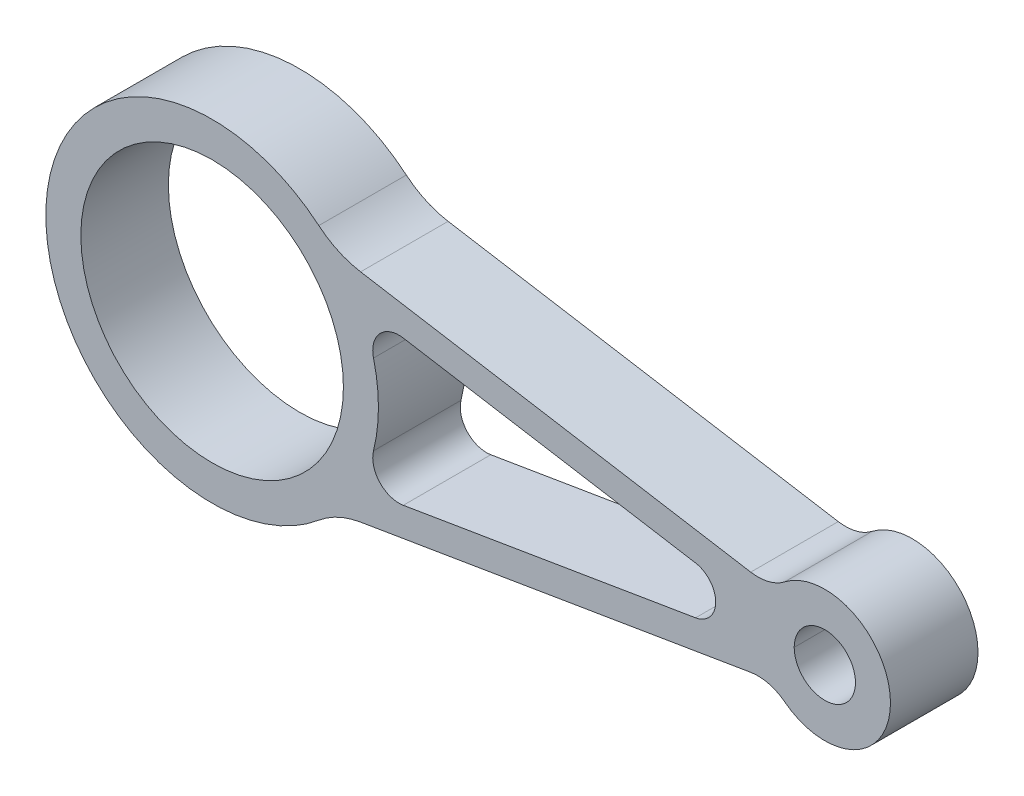
ISO-10303-21;
HEADER;
FILE_DESCRIPTION(('STEP AP214'),'2;1');
FILE_NAME('part.step','',(''),(''),'','','');
FILE_SCHEMA(('AUTOMOTIVE_DESIGN { 1 0 10303 214 1 1 1 1 }'));
ENDSEC;
DATA;
#1=APPLICATION_CONTEXT('core data for automotive mechanical design processes');
#2=APPLICATION_PROTOCOL_DEFINITION('international standard','automotive_design',2000,#1);
#3=PRODUCT_CONTEXT('',#1,'mechanical');
#4=PRODUCT('Part','Part','',(#3));
#5=PRODUCT_RELATED_PRODUCT_CATEGORY('part','',(#4));
#6=PRODUCT_DEFINITION_FORMATION('','',#4);
#7=PRODUCT_DEFINITION_CONTEXT('part definition',#1,'design');
#8=PRODUCT_DEFINITION('design','',#6,#7);
#9=PRODUCT_DEFINITION_SHAPE('','',#8);
#10=(LENGTH_UNIT() NAMED_UNIT(*) SI_UNIT(.MILLI.,.METRE.));
#11=(NAMED_UNIT(*) PLANE_ANGLE_UNIT() SI_UNIT($,.RADIAN.));
#12=(NAMED_UNIT(*) SI_UNIT($,.STERADIAN.) SOLID_ANGLE_UNIT());
#13=UNCERTAINTY_MEASURE_WITH_UNIT(LENGTH_MEASURE(1.E-05),#10,'distance_accuracy_value','');
#14=(GEOMETRIC_REPRESENTATION_CONTEXT(3) GLOBAL_UNCERTAINTY_ASSIGNED_CONTEXT((#13)) GLOBAL_UNIT_ASSIGNED_CONTEXT((#10,
#11,#12)) REPRESENTATION_CONTEXT('',''));
#15=CARTESIAN_POINT('',(0.,0.,0.));
#16=DIRECTION('',(0.,0.,1.));
#17=DIRECTION('',(1.,0.,0.));
#18=AXIS2_PLACEMENT_3D('',#15,#16,#17);
#19=CARTESIAN_POINT('',(140.,0.,10.));
#20=DIRECTION('',(0.,0.,-1.));
#21=DIRECTION('',(-1.,0.,0.));
#22=AXIS2_PLACEMENT_3D('',#19,#20,#21);
#23=CYLINDRICAL_SURFACE('',#22,7.00000000000001);
#24=CARTESIAN_POINT('',(140.,0.,10.));
#25=DIRECTION('',(0.,0.,1.));
#26=DIRECTION('',(1.,0.,0.));
#27=AXIS2_PLACEMENT_3D('',#24,#25,#26);
#28=CIRCLE('',#27,7.00000000000001);
#29=CARTESIAN_POINT('',(133.,0.,10.));
#30=VERTEX_POINT('',#29);
#31=CARTESIAN_POINT('',(147.,0.,10.));
#32=VERTEX_POINT('',#31);
#33=EDGE_CURVE('E211',#30,#32,#28,.T.);
#34=ORIENTED_EDGE('',*,*,#33,.T.);
#35=DIRECTION('',(0.,0.,-1.));
#36=VECTOR('',#35,1.);
#37=CARTESIAN_POINT('',(147.,0.,10.));
#38=LINE('',#37,#36);
#39=CARTESIAN_POINT('',(147.,0.,-10.));
#40=VERTEX_POINT('',#39);
#41=EDGE_CURVE('E11',#32,#40,#38,.T.);
#42=ORIENTED_EDGE('',*,*,#41,.T.);
#43=CARTESIAN_POINT('',(140.,0.,-10.));
#44=DIRECTION('',(0.,0.,1.));
#45=DIRECTION('',(1.,0.,0.));
#46=AXIS2_PLACEMENT_3D('',#43,#44,#45);
#47=CIRCLE('',#46,7.00000000000001);
#48=CARTESIAN_POINT('',(133.,0.,-10.));
#49=VERTEX_POINT('',#48);
#50=EDGE_CURVE('E215',#49,#40,#47,.T.);
#51=ORIENTED_EDGE('',*,*,#50,.F.);
#52=DIRECTION('',(0.,0.,1.));
#53=VECTOR('',#52,1.);
#54=CARTESIAN_POINT('',(133.,0.,10.));
#55=LINE('',#54,#53);
#56=EDGE_CURVE('E49',#49,#30,#55,.T.);
#57=ORIENTED_EDGE('',*,*,#56,.T.);
#58=EDGE_LOOP('',(#34,#42,#51,#57));
#59=FACE_BOUND('',#58,.T.);
#60=ADVANCED_FACE('F40',(#59),#23,.F.);
#61=CARTESIAN_POINT('',(0.,0.,10.));
#62=DIRECTION('',(0.,0.,1.));
#63=DIRECTION('',(1.,0.,0.));
#64=AXIS2_PLACEMENT_3D('',#61,#62,#63);
#65=PLANE('',#64);
#66=CARTESIAN_POINT('',(109.565217391304,0.,10.));
#67=DIRECTION('',(0.,0.,1.));
#68=DIRECTION('',(-1.,0.,0.));
#69=AXIS2_PLACEMENT_3D('',#66,#67,#68);
#70=CIRCLE('',#69,5.5);
#71=CARTESIAN_POINT('',(110.468788819876,-5.42527037791384,10.));
#72=VERTEX_POINT('',#71);
#73=CARTESIAN_POINT('',(110.468788819876,5.42527037791384,10.));
#74=VERTEX_POINT('',#73);
#75=EDGE_CURVE('E158',#72,#74,#70,.T.);
#76=ORIENTED_EDGE('',*,*,#75,.F.);
#77=DIRECTION('',(0.986412795984335,0.164285714285714,0.));
#78=VECTOR('',#77,1.);
#79=CARTESIAN_POINT('',(110.468788819876,-5.42527037791384,10.));
#80=LINE('',#79,#78);
#81=CARTESIAN_POINT('',(43.6823589039623,-16.5484597647463,10.));
#82=VERTEX_POINT('',#81);
#83=EDGE_CURVE('E177',#82,#72,#80,.T.);
#84=ORIENTED_EDGE('',*,*,#83,.F.);
#85=CARTESIAN_POINT('',(42.696644618248,-10.6299829888402,10.));
#86=DIRECTION('',(0.,0.,1.));
#87=DIRECTION('',(-1.,0.,0.));
#88=AXIS2_PLACEMENT_3D('',#85,#86,#87);
#89=CIRCLE('',#88,6.);
#90=CARTESIAN_POINT('',(36.8743748975778,-9.18043985399842,10.));
#91=VERTEX_POINT('',#90);
#92=EDGE_CURVE('E180',#91,#82,#89,.T.);
#93=ORIENTED_EDGE('',*,*,#92,.F.);
#94=CARTESIAN_POINT('',(0.,0.,10.));
#95=DIRECTION('',(0.,0.,-1.));
#96=DIRECTION('',(1.,0.,0.));
#97=AXIS2_PLACEMENT_3D('',#94,#95,#96);
#98=CIRCLE('',#97,38.);
#99=CARTESIAN_POINT('',(36.8743748975778,9.18043985399841,10.));
#100=VERTEX_POINT('',#99);
#101=EDGE_CURVE('E196',#100,#91,#98,.T.);
#102=ORIENTED_EDGE('',*,*,#101,.F.);
#103=CARTESIAN_POINT('',(42.696644618248,10.6299829888403,10.));
#104=DIRECTION('',(0.,0.,1.));
#105=DIRECTION('',(1.,0.,0.));
#106=AXIS2_PLACEMENT_3D('',#103,#104,#105);
#107=CIRCLE('',#106,6.);
#108=CARTESIAN_POINT('',(43.6823589039623,16.5484597647463,10.));
#109=VERTEX_POINT('',#108);
#110=EDGE_CURVE('E193',#109,#100,#107,.T.);
#111=ORIENTED_EDGE('',*,*,#110,.F.);
#112=DIRECTION('',(-0.986412795984335,0.164285714285714,0.));
#113=VECTOR('',#112,1.);
#114=CARTESIAN_POINT('',(43.6823589039623,16.5484597647463,10.));
#115=LINE('',#114,#113);
#116=EDGE_CURVE('E191',#74,#109,#115,.T.);
#117=ORIENTED_EDGE('',*,*,#116,.F.);
#118=EDGE_LOOP('',(#76,#84,#93,#102,#111,#117));
#119=FACE_BOUND('',#118,.T.);
#120=CARTESIAN_POINT('',(0.,0.,10.));
#121=DIRECTION('',(0.,0.,1.));
#122=DIRECTION('',(1.,0.,0.));
#123=AXIS2_PLACEMENT_3D('',#120,#121,#122);
#124=CIRCLE('',#123,30.);
#125=CARTESIAN_POINT('',(30.,0.,10.));
#126=VERTEX_POINT('',#125);
#127=EDGE_CURVE('E218',#126,#126,#124,.T.);
#128=ORIENTED_EDGE('',*,*,#127,.F.);
#129=EDGE_LOOP('',(#128));
#130=FACE_BOUND('',#129,.T.);
#131=CARTESIAN_POINT('',(140.,0.,10.));
#132=DIRECTION('',(0.,0.,1.));
#133=DIRECTION('',(1.,0.,0.));
#134=AXIS2_PLACEMENT_3D('',#131,#132,#133);
#135=CIRCLE('',#134,15.);
#136=CARTESIAN_POINT('',(130.826967155943,-11.8682546501942,10.));
#137=VERTEX_POINT('',#136);
#138=CARTESIAN_POINT('',(130.826967155943,11.8682546501942,10.));
#139=VERTEX_POINT('',#138);
#140=EDGE_CURVE('E231',#137,#139,#135,.T.);
#141=ORIENTED_EDGE('',*,*,#140,.T.);
#142=CARTESIAN_POINT('',(124.711611926572,19.7804244169904,10.));
#143=DIRECTION('',(0.,0.,1.));
#144=DIRECTION('',(1.,0.,0.));
#145=AXIS2_PLACEMENT_3D('',#142,#143,#144);
#146=CIRCLE('',#145,10.);
#147=CARTESIAN_POINT('',(123.068754783715,9.91629645714704,10.));
#148=VERTEX_POINT('',#147);
#149=EDGE_CURVE('E281',#139,#148,#146,.F.);
#150=ORIENTED_EDGE('',*,*,#149,.T.);
#151=DIRECTION('',(-0.986412795984335,0.164285714285714,0.));
#152=VECTOR('',#151,1.);
#153=CARTESIAN_POINT('',(27.9354736759495,25.7606154914888,10.));
#154=LINE('',#153,#152);
#155=CARTESIAN_POINT('',(33.9230677395359,24.7633898151861,10.));
#156=VERTEX_POINT('',#155);
#157=EDGE_CURVE('E234',#148,#156,#154,.T.);
#158=ORIENTED_EDGE('',*,*,#157,.T.);
#159=CARTESIAN_POINT('',(37.2087820252501,44.4916457348728,10.));
#160=DIRECTION('',(0.,0.,1.));
#161=DIRECTION('',(1.,0.,0.));
#162=AXIS2_PLACEMENT_3D('',#159,#160,#161);
#163=CIRCLE('',#162,20.);
#164=CARTESIAN_POINT('',(24.3781675337846,29.1496989297442,10.));
#165=VERTEX_POINT('',#164);
#166=EDGE_CURVE('E263',#156,#165,#163,.F.);
#167=ORIENTED_EDGE('',*,*,#166,.T.);
#168=CARTESIAN_POINT('',(0.,0.,10.));
#169=DIRECTION('',(0.,0.,1.));
#170=DIRECTION('',(1.,0.,0.));
#171=AXIS2_PLACEMENT_3D('',#168,#169,#170);
#172=CIRCLE('',#171,38.);
#173=CARTESIAN_POINT('',(24.3781675337846,-29.1496989297442,10.));
#174=VERTEX_POINT('',#173);
#175=EDGE_CURVE('E224',#165,#174,#172,.T.);
#176=ORIENTED_EDGE('',*,*,#175,.T.);
#177=CARTESIAN_POINT('',(37.2087820252502,-44.4916457348727,10.));
#178=DIRECTION('',(0.,0.,1.));
#179=DIRECTION('',(1.,0.,0.));
#180=AXIS2_PLACEMENT_3D('',#177,#178,#179);
#181=CIRCLE('',#180,20.);
#182=CARTESIAN_POINT('',(33.9230677395359,-24.763389815186,10.));
#183=VERTEX_POINT('',#182);
#184=EDGE_CURVE('E258',#174,#183,#181,.F.);
#185=ORIENTED_EDGE('',*,*,#184,.T.);
#186=DIRECTION('',(0.986412795984335,0.164285714285714,0.));
#187=VECTOR('',#186,1.);
#188=CARTESIAN_POINT('',(27.9354736759495,-25.7606154914888,10.));
#189=LINE('',#188,#187);
#190=CARTESIAN_POINT('',(123.068754783715,-9.91629645714704,10.));
#191=VERTEX_POINT('',#190);
#192=EDGE_CURVE('E227',#183,#191,#189,.T.);
#193=ORIENTED_EDGE('',*,*,#192,.T.);
#194=CARTESIAN_POINT('',(124.711611926572,-19.7804244169904,10.));
#195=DIRECTION('',(0.,0.,1.));
#196=DIRECTION('',(1.,0.,0.));
#197=AXIS2_PLACEMENT_3D('',#194,#195,#196);
#198=CIRCLE('',#197,10.);
#199=EDGE_CURVE('E277',#191,#137,#198,.F.);
#200=ORIENTED_EDGE('',*,*,#199,.T.);
#201=EDGE_LOOP('',(#141,#150,#158,#167,#176,#185,#193,#200));
#202=FACE_BOUND('',#201,.T.);
#203=ORIENTED_EDGE('',*,*,#33,.F.);
#204=EDGE_CURVE('E214',#32,#30,#28,.T.);
#205=ORIENTED_EDGE('',*,*,#204,.F.);
#206=EDGE_LOOP('',(#203,#205));
#207=FACE_BOUND('',#206,.T.);
#208=ADVANCED_FACE('F289',(#119,#130,#202,#207),#65,.T.);
#209=CARTESIAN_POINT('',(0.,0.,-10.));
#210=DIRECTION('',(0.,0.,1.));
#211=DIRECTION('',(1.,0.,0.));
#212=AXIS2_PLACEMENT_3D('',#209,#210,#211);
#213=PLANE('',#212);
#214=DIRECTION('',(0.986412795984335,0.164285714285714,0.));
#215=VECTOR('',#214,1.);
#216=CARTESIAN_POINT('',(110.468788819876,-5.42527037791384,-10.));
#217=LINE('',#216,#215);
#218=CARTESIAN_POINT('',(43.6823589039623,-16.5484597647463,-10.));
#219=VERTEX_POINT('',#218);
#220=CARTESIAN_POINT('',(110.468788819876,-5.42527037791384,-10.));
#221=VERTEX_POINT('',#220);
#222=EDGE_CURVE('E163',#219,#221,#217,.T.);
#223=ORIENTED_EDGE('',*,*,#222,.T.);
#224=CARTESIAN_POINT('',(109.565217391304,0.,-10.));
#225=DIRECTION('',(0.,0.,1.));
#226=DIRECTION('',(-1.,0.,0.));
#227=AXIS2_PLACEMENT_3D('',#224,#225,#226);
#228=CIRCLE('',#227,5.5);
#229=CARTESIAN_POINT('',(110.468788819876,5.42527037791384,-10.));
#230=VERTEX_POINT('',#229);
#231=EDGE_CURVE('E155',#221,#230,#228,.T.);
#232=ORIENTED_EDGE('',*,*,#231,.T.);
#233=DIRECTION('',(-0.986412795984335,0.164285714285714,0.));
#234=VECTOR('',#233,1.);
#235=CARTESIAN_POINT('',(43.6823589039623,16.5484597647463,-10.));
#236=LINE('',#235,#234);
#237=CARTESIAN_POINT('',(43.6823589039623,16.5484597647463,-10.));
#238=VERTEX_POINT('',#237);
#239=EDGE_CURVE('E167',#230,#238,#236,.T.);
#240=ORIENTED_EDGE('',*,*,#239,.T.);
#241=CARTESIAN_POINT('',(42.696644618248,10.6299829888403,-10.));
#242=DIRECTION('',(0.,0.,1.));
#243=DIRECTION('',(1.,0.,0.));
#244=AXIS2_PLACEMENT_3D('',#241,#242,#243);
#245=CIRCLE('',#244,6.);
#246=CARTESIAN_POINT('',(36.8743748975778,9.18043985399841,-10.));
#247=VERTEX_POINT('',#246);
#248=EDGE_CURVE('E171',#238,#247,#245,.T.);
#249=ORIENTED_EDGE('',*,*,#248,.T.);
#250=CARTESIAN_POINT('',(0.,0.,-10.));
#251=DIRECTION('',(0.,0.,-1.));
#252=DIRECTION('',(1.,0.,0.));
#253=AXIS2_PLACEMENT_3D('',#250,#251,#252);
#254=CIRCLE('',#253,38.);
#255=CARTESIAN_POINT('',(36.8743748975778,-9.18043985399842,-10.));
#256=VERTEX_POINT('',#255);
#257=EDGE_CURVE('E184',#247,#256,#254,.T.);
#258=ORIENTED_EDGE('',*,*,#257,.T.);
#259=CARTESIAN_POINT('',(42.696644618248,-10.6299829888402,-10.));
#260=DIRECTION('',(0.,0.,1.));
#261=DIRECTION('',(-1.,0.,0.));
#262=AXIS2_PLACEMENT_3D('',#259,#260,#261);
#263=CIRCLE('',#262,6.);
#264=EDGE_CURVE('E187',#256,#219,#263,.T.);
#265=ORIENTED_EDGE('',*,*,#264,.T.);
#266=EDGE_LOOP('',(#223,#232,#240,#249,#258,#265));
#267=FACE_BOUND('',#266,.T.);
#268=CARTESIAN_POINT('',(0.,0.,-10.));
#269=DIRECTION('',(0.,0.,1.));
#270=DIRECTION('',(1.,0.,0.));
#271=AXIS2_PLACEMENT_3D('',#268,#269,#270);
#272=CIRCLE('',#271,38.);
#273=CARTESIAN_POINT('',(24.3781675337846,29.1496989297442,-10.));
#274=VERTEX_POINT('',#273);
#275=CARTESIAN_POINT('',(24.3781675337846,-29.1496989297442,-10.));
#276=VERTEX_POINT('',#275);
#277=EDGE_CURVE('E221',#274,#276,#272,.T.);
#278=ORIENTED_EDGE('',*,*,#277,.F.);
#279=CARTESIAN_POINT('',(37.2087820252501,44.4916457348728,-10.));
#280=DIRECTION('',(0.,0.,1.));
#281=DIRECTION('',(1.,0.,0.));
#282=AXIS2_PLACEMENT_3D('',#279,#280,#281);
#283=CIRCLE('',#282,20.);
#284=CARTESIAN_POINT('',(33.9230677395359,24.7633898151861,-10.));
#285=VERTEX_POINT('',#284);
#286=EDGE_CURVE('E260',#274,#285,#283,.T.);
#287=ORIENTED_EDGE('',*,*,#286,.T.);
#288=DIRECTION('',(-0.986412795984335,0.164285714285714,0.));
#289=VECTOR('',#288,1.);
#290=CARTESIAN_POINT('',(27.9354736759495,25.7606154914888,-10.));
#291=LINE('',#290,#289);
#292=CARTESIAN_POINT('',(123.068754783715,9.91629645714704,-10.));
#293=VERTEX_POINT('',#292);
#294=EDGE_CURVE('E228',#293,#285,#291,.T.);
#295=ORIENTED_EDGE('',*,*,#294,.F.);
#296=CARTESIAN_POINT('',(124.711611926572,19.7804244169904,-10.));
#297=DIRECTION('',(0.,0.,1.));
#298=DIRECTION('',(1.,0.,0.));
#299=AXIS2_PLACEMENT_3D('',#296,#297,#298);
#300=CIRCLE('',#299,10.);
#301=CARTESIAN_POINT('',(130.826967155943,11.8682546501942,-10.));
#302=VERTEX_POINT('',#301);
#303=EDGE_CURVE('E279',#293,#302,#300,.T.);
#304=ORIENTED_EDGE('',*,*,#303,.T.);
#305=CARTESIAN_POINT('',(140.,0.,-10.));
#306=DIRECTION('',(0.,0.,1.));
#307=DIRECTION('',(1.,0.,0.));
#308=AXIS2_PLACEMENT_3D('',#305,#306,#307);
#309=CIRCLE('',#308,15.);
#310=CARTESIAN_POINT('',(130.826967155943,-11.8682546501942,-10.));
#311=VERTEX_POINT('',#310);
#312=EDGE_CURVE('E242',#311,#302,#309,.T.);
#313=ORIENTED_EDGE('',*,*,#312,.F.);
#314=CARTESIAN_POINT('',(124.711611926572,-19.7804244169904,-10.));
#315=DIRECTION('',(0.,0.,1.));
#316=DIRECTION('',(1.,0.,0.));
#317=AXIS2_PLACEMENT_3D('',#314,#315,#316);
#318=CIRCLE('',#317,10.);
#319=CARTESIAN_POINT('',(123.068754783715,-9.91629645714704,-10.));
#320=VERTEX_POINT('',#319);
#321=EDGE_CURVE('E275',#311,#320,#318,.T.);
#322=ORIENTED_EDGE('',*,*,#321,.T.);
#323=DIRECTION('',(0.986412795984335,0.164285714285714,0.));
#324=VECTOR('',#323,1.);
#325=CARTESIAN_POINT('',(27.9354736759495,-25.7606154914888,-10.));
#326=LINE('',#325,#324);
#327=CARTESIAN_POINT('',(33.9230677395359,-24.763389815186,-10.));
#328=VERTEX_POINT('',#327);
#329=EDGE_CURVE('E239',#328,#320,#326,.T.);
#330=ORIENTED_EDGE('',*,*,#329,.F.);
#331=CARTESIAN_POINT('',(37.2087820252502,-44.4916457348727,-10.));
#332=DIRECTION('',(0.,0.,1.));
#333=DIRECTION('',(1.,0.,0.));
#334=AXIS2_PLACEMENT_3D('',#331,#332,#333);
#335=CIRCLE('',#334,20.);
#336=EDGE_CURVE('E256',#328,#276,#335,.T.);
#337=ORIENTED_EDGE('',*,*,#336,.T.);
#338=EDGE_LOOP('',(#278,#287,#295,#304,#313,#322,#330,#337));
#339=FACE_BOUND('',#338,.T.);
#340=CARTESIAN_POINT('',(0.,0.,-10.));
#341=DIRECTION('',(0.,0.,1.));
#342=DIRECTION('',(1.,0.,0.));
#343=AXIS2_PLACEMENT_3D('',#340,#341,#342);
#344=CIRCLE('',#343,30.);
#345=CARTESIAN_POINT('',(30.,0.,-10.));
#346=VERTEX_POINT('',#345);
#347=EDGE_CURVE('E213',#346,#346,#344,.T.);
#348=ORIENTED_EDGE('',*,*,#347,.T.);
#349=EDGE_LOOP('',(#348));
#350=FACE_BOUND('',#349,.T.);
#351=ORIENTED_EDGE('',*,*,#50,.T.);
#352=EDGE_CURVE('E203',#40,#49,#47,.T.);
#353=ORIENTED_EDGE('',*,*,#352,.T.);
#354=EDGE_LOOP('',(#351,#353));
#355=FACE_BOUND('',#354,.T.);
#356=ADVANCED_FACE('F173',(#267,#339,#350,#355),#213,.F.);
#357=CARTESIAN_POINT('',(0.,0.,10.));
#358=DIRECTION('',(0.,0.,-1.));
#359=DIRECTION('',(-1.,0.,0.));
#360=AXIS2_PLACEMENT_3D('',#357,#358,#359);
#361=CYLINDRICAL_SURFACE('',#360,38.);
#362=ORIENTED_EDGE('',*,*,#277,.T.);
#363=DIRECTION('',(0.,0.,-1.));
#364=VECTOR('',#363,1.);
#365=CARTESIAN_POINT('',(24.3781675337846,-29.1496989297442,10.));
#366=LINE('',#365,#364);
#367=EDGE_CURVE('E251',#276,#174,#366,.F.);
#368=ORIENTED_EDGE('',*,*,#367,.T.);
#369=ORIENTED_EDGE('',*,*,#175,.F.);
#370=DIRECTION('',(0.,0.,-1.));
#371=VECTOR('',#370,1.);
#372=CARTESIAN_POINT('',(24.3781675337846,29.1496989297442,10.));
#373=LINE('',#372,#371);
#374=EDGE_CURVE('E248',#165,#274,#373,.T.);
#375=ORIENTED_EDGE('',*,*,#374,.T.);
#376=EDGE_LOOP('',(#362,#368,#369,#375));
#377=FACE_BOUND('',#376,.T.);
#378=ADVANCED_FACE('F315',(#377),#361,.T.);
#379=CARTESIAN_POINT('',(27.9354736759495,-25.7606154914888,10.));
#380=DIRECTION('',(-0.164285714285714,0.986412795984335,0.));
#381=DIRECTION('',(-0.986412795984335,-0.164285714285714,0.));
#382=AXIS2_PLACEMENT_3D('',#379,#380,#381);
#383=PLANE('',#382);
#384=ORIENTED_EDGE('',*,*,#329,.T.);
#385=DIRECTION('',(0.,0.,1.));
#386=VECTOR('',#385,1.);
#387=CARTESIAN_POINT('',(123.068754783715,-9.91629645714703,10.));
#388=LINE('',#387,#386);
#389=EDGE_CURVE('E270',#320,#191,#388,.T.);
#390=ORIENTED_EDGE('',*,*,#389,.T.);
#391=ORIENTED_EDGE('',*,*,#192,.F.);
#392=DIRECTION('',(0.,0.,1.));
#393=VECTOR('',#392,1.);
#394=CARTESIAN_POINT('',(33.9230677395359,-24.763389815186,-10.));
#395=LINE('',#394,#393);
#396=EDGE_CURVE('E236',#183,#328,#395,.F.);
#397=ORIENTED_EDGE('',*,*,#396,.T.);
#398=EDGE_LOOP('',(#384,#390,#391,#397));
#399=FACE_BOUND('',#398,.T.);
#400=ADVANCED_FACE('F325',(#399),#383,.F.);
#401=CARTESIAN_POINT('',(140.,0.,10.));
#402=DIRECTION('',(0.,0.,-1.));
#403=DIRECTION('',(-1.,0.,0.));
#404=AXIS2_PLACEMENT_3D('',#401,#402,#403);
#405=CYLINDRICAL_SURFACE('',#404,15.);
#406=ORIENTED_EDGE('',*,*,#140,.F.);
#407=DIRECTION('',(0.,0.,-1.));
#408=VECTOR('',#407,1.);
#409=CARTESIAN_POINT('',(130.826967155943,-11.8682546501942,10.));
#410=LINE('',#409,#408);
#411=EDGE_CURVE('E267',#137,#311,#410,.T.);
#412=ORIENTED_EDGE('',*,*,#411,.T.);
#413=ORIENTED_EDGE('',*,*,#312,.T.);
#414=DIRECTION('',(0.,0.,-1.));
#415=VECTOR('',#414,1.);
#416=CARTESIAN_POINT('',(130.826967155943,11.8682546501942,10.));
#417=LINE('',#416,#415);
#418=EDGE_CURVE('E265',#302,#139,#417,.F.);
#419=ORIENTED_EDGE('',*,*,#418,.T.);
#420=EDGE_LOOP('',(#406,#412,#413,#419));
#421=FACE_BOUND('',#420,.T.);
#422=ADVANCED_FACE('F321',(#421),#405,.T.);
#423=CARTESIAN_POINT('',(27.9354736759495,25.7606154914888,10.));
#424=DIRECTION('',(-0.164285714285714,-0.986412795984335,0.));
#425=DIRECTION('',(0.986412795984335,-0.164285714285714,0.));
#426=AXIS2_PLACEMENT_3D('',#423,#424,#425);
#427=PLANE('',#426);
#428=ORIENTED_EDGE('',*,*,#157,.F.);
#429=DIRECTION('',(0.,0.,1.));
#430=VECTOR('',#429,1.);
#431=CARTESIAN_POINT('',(123.068754783715,9.91629645714703,-10.));
#432=LINE('',#431,#430);
#433=EDGE_CURVE('E272',#148,#293,#432,.F.);
#434=ORIENTED_EDGE('',*,*,#433,.T.);
#435=ORIENTED_EDGE('',*,*,#294,.T.);
#436=DIRECTION('',(0.,0.,1.));
#437=VECTOR('',#436,1.);
#438=CARTESIAN_POINT('',(33.9230677395359,24.7633898151861,10.));
#439=LINE('',#438,#437);
#440=EDGE_CURVE('E253',#285,#156,#439,.T.);
#441=ORIENTED_EDGE('',*,*,#440,.T.);
#442=EDGE_LOOP('',(#428,#434,#435,#441));
#443=FACE_BOUND('',#442,.T.);
#444=ADVANCED_FACE('F302',(#443),#427,.F.);
#445=CARTESIAN_POINT('',(0.,0.,10.));
#446=DIRECTION('',(0.,0.,-1.));
#447=DIRECTION('',(-1.,0.,0.));
#448=AXIS2_PLACEMENT_3D('',#445,#446,#447);
#449=CYLINDRICAL_SURFACE('',#448,30.);
#450=ORIENTED_EDGE('',*,*,#127,.T.);
#451=EDGE_LOOP('',(#450));
#452=FACE_BOUND('',#451,.T.);
#453=ORIENTED_EDGE('',*,*,#347,.F.);
#454=EDGE_LOOP('',(#453));
#455=FACE_BOUND('',#454,.T.);
#456=ADVANCED_FACE('F293',(#452,#455),#449,.F.);
#457=ORIENTED_EDGE('',*,*,#41,.F.);
#458=ORIENTED_EDGE('',*,*,#204,.T.);
#459=ORIENTED_EDGE('',*,*,#56,.F.);
#460=ORIENTED_EDGE('',*,*,#352,.F.);
#461=EDGE_LOOP('',(#457,#458,#459,#460));
#462=FACE_BOUND('',#461,.T.);
#463=ADVANCED_FACE('F290',(#462),#23,.F.);
#464=CARTESIAN_POINT('',(37.2087820252502,-44.4916457348727,10.));
#465=DIRECTION('',(0.,0.,-1.));
#466=DIRECTION('',(-1.,0.,0.));
#467=AXIS2_PLACEMENT_3D('',#464,#465,#466);
#468=CYLINDRICAL_SURFACE('',#467,20.);
#469=ORIENTED_EDGE('',*,*,#184,.F.);
#470=ORIENTED_EDGE('',*,*,#367,.F.);
#471=ORIENTED_EDGE('',*,*,#336,.F.);
#472=ORIENTED_EDGE('',*,*,#396,.F.);
#473=EDGE_LOOP('',(#469,#470,#471,#472));
#474=FACE_BOUND('',#473,.T.);
#475=ADVANCED_FACE('F292',(#474),#468,.F.);
#476=CARTESIAN_POINT('',(37.2087820252501,44.4916457348728,10.));
#477=DIRECTION('',(0.,0.,-1.));
#478=DIRECTION('',(-1.,0.,0.));
#479=AXIS2_PLACEMENT_3D('',#476,#477,#478);
#480=CYLINDRICAL_SURFACE('',#479,20.);
#481=ORIENTED_EDGE('',*,*,#166,.F.);
#482=ORIENTED_EDGE('',*,*,#440,.F.);
#483=ORIENTED_EDGE('',*,*,#286,.F.);
#484=ORIENTED_EDGE('',*,*,#374,.F.);
#485=EDGE_LOOP('',(#481,#482,#483,#484));
#486=FACE_BOUND('',#485,.T.);
#487=ADVANCED_FACE('F299',(#486),#480,.F.);
#488=CARTESIAN_POINT('',(124.711611926572,-19.7804244169904,10.));
#489=DIRECTION('',(0.,0.,-1.));
#490=DIRECTION('',(-1.,0.,0.));
#491=AXIS2_PLACEMENT_3D('',#488,#489,#490);
#492=CYLINDRICAL_SURFACE('',#491,10.);
#493=ORIENTED_EDGE('',*,*,#199,.F.);
#494=ORIENTED_EDGE('',*,*,#389,.F.);
#495=ORIENTED_EDGE('',*,*,#321,.F.);
#496=ORIENTED_EDGE('',*,*,#411,.F.);
#497=EDGE_LOOP('',(#493,#494,#495,#496));
#498=FACE_BOUND('',#497,.T.);
#499=ADVANCED_FACE('F334',(#498),#492,.F.);
#500=CARTESIAN_POINT('',(124.711611926572,19.7804244169904,10.));
#501=DIRECTION('',(0.,0.,-1.));
#502=DIRECTION('',(-1.,0.,0.));
#503=AXIS2_PLACEMENT_3D('',#500,#501,#502);
#504=CYLINDRICAL_SURFACE('',#503,10.);
#505=ORIENTED_EDGE('',*,*,#149,.F.);
#506=ORIENTED_EDGE('',*,*,#418,.F.);
#507=ORIENTED_EDGE('',*,*,#303,.F.);
#508=ORIENTED_EDGE('',*,*,#433,.F.);
#509=EDGE_LOOP('',(#505,#506,#507,#508));
#510=FACE_BOUND('',#509,.T.);
#511=ADVANCED_FACE('F42',(#510),#504,.F.);
#512=CARTESIAN_POINT('',(109.565217391304,0.,-10.));
#513=DIRECTION('',(0.,0.,1.));
#514=DIRECTION('',(1.,0.,0.));
#515=AXIS2_PLACEMENT_3D('',#512,#513,#514);
#516=CYLINDRICAL_SURFACE('',#515,5.5);
#517=ORIENTED_EDGE('',*,*,#75,.T.);
#518=DIRECTION('',(0.,0.,1.));
#519=VECTOR('',#518,1.);
#520=CARTESIAN_POINT('',(110.468788819876,5.42527037791384,-10.));
#521=LINE('',#520,#519);
#522=EDGE_CURVE('E151',#230,#74,#521,.T.);
#523=ORIENTED_EDGE('',*,*,#522,.F.);
#524=ORIENTED_EDGE('',*,*,#231,.F.);
#525=DIRECTION('',(0.,0.,1.));
#526=VECTOR('',#525,1.);
#527=CARTESIAN_POINT('',(110.468788819876,-5.42527037791384,-10.));
#528=LINE('',#527,#526);
#529=EDGE_CURVE('E201',#221,#72,#528,.T.);
#530=ORIENTED_EDGE('',*,*,#529,.T.);
#531=EDGE_LOOP('',(#517,#523,#524,#530));
#532=FACE_BOUND('',#531,.T.);
#533=ADVANCED_FACE('F153',(#532),#516,.F.);
#534=CARTESIAN_POINT('',(110.468788819876,-5.42527037791384,-10.));
#535=DIRECTION('',(0.164285714285714,-0.986412795984335,0.));
#536=DIRECTION('',(0.986412795984335,0.164285714285714,0.));
#537=AXIS2_PLACEMENT_3D('',#534,#535,#536);
#538=PLANE('',#537);
#539=ORIENTED_EDGE('',*,*,#83,.T.);
#540=ORIENTED_EDGE('',*,*,#529,.F.);
#541=ORIENTED_EDGE('',*,*,#222,.F.);
#542=DIRECTION('',(0.,0.,1.));
#543=VECTOR('',#542,1.);
#544=CARTESIAN_POINT('',(43.6823589039623,-16.5484597647463,-10.));
#545=LINE('',#544,#543);
#546=EDGE_CURVE('E204',#219,#82,#545,.T.);
#547=ORIENTED_EDGE('',*,*,#546,.T.);
#548=EDGE_LOOP('',(#539,#540,#541,#547));
#549=FACE_BOUND('',#548,.T.);
#550=ADVANCED_FACE('F370',(#549),#538,.F.);
#551=CARTESIAN_POINT('',(42.696644618248,-10.6299829888402,-10.));
#552=DIRECTION('',(0.,0.,1.));
#553=DIRECTION('',(1.,0.,0.));
#554=AXIS2_PLACEMENT_3D('',#551,#552,#553);
#555=CYLINDRICAL_SURFACE('',#554,6.);
#556=ORIENTED_EDGE('',*,*,#92,.T.);
#557=ORIENTED_EDGE('',*,*,#546,.F.);
#558=ORIENTED_EDGE('',*,*,#264,.F.);
#559=DIRECTION('',(0.,0.,1.));
#560=VECTOR('',#559,1.);
#561=CARTESIAN_POINT('',(36.8743748975778,-9.18043985399842,-10.));
#562=LINE('',#561,#560);
#563=EDGE_CURVE('E206',#256,#91,#562,.T.);
#564=ORIENTED_EDGE('',*,*,#563,.T.);
#565=EDGE_LOOP('',(#556,#557,#558,#564));
#566=FACE_BOUND('',#565,.T.);
#567=ADVANCED_FACE('F374',(#566),#555,.F.);
#568=CARTESIAN_POINT('',(0.,0.,-10.));
#569=DIRECTION('',(0.,0.,1.));
#570=DIRECTION('',(1.,0.,0.));
#571=AXIS2_PLACEMENT_3D('',#568,#569,#570);
#572=CYLINDRICAL_SURFACE('',#571,38.);
#573=ORIENTED_EDGE('',*,*,#101,.T.);
#574=ORIENTED_EDGE('',*,*,#563,.F.);
#575=ORIENTED_EDGE('',*,*,#257,.F.);
#576=DIRECTION('',(0.,0.,1.));
#577=VECTOR('',#576,1.);
#578=CARTESIAN_POINT('',(36.8743748975778,9.18043985399841,-10.));
#579=LINE('',#578,#577);
#580=EDGE_CURVE('E208',#247,#100,#579,.T.);
#581=ORIENTED_EDGE('',*,*,#580,.T.);
#582=EDGE_LOOP('',(#573,#574,#575,#581));
#583=FACE_BOUND('',#582,.T.);
#584=ADVANCED_FACE('F383',(#583),#572,.T.);
#585=CARTESIAN_POINT('',(42.696644618248,10.6299829888403,-10.));
#586=DIRECTION('',(0.,0.,1.));
#587=DIRECTION('',(1.,0.,0.));
#588=AXIS2_PLACEMENT_3D('',#585,#586,#587);
#589=CYLINDRICAL_SURFACE('',#588,6.);
#590=ORIENTED_EDGE('',*,*,#110,.T.);
#591=ORIENTED_EDGE('',*,*,#580,.F.);
#592=ORIENTED_EDGE('',*,*,#248,.F.);
#593=DIRECTION('',(0.,0.,1.));
#594=VECTOR('',#593,1.);
#595=CARTESIAN_POINT('',(43.6823589039623,16.5484597647463,-10.));
#596=LINE('',#595,#594);
#597=EDGE_CURVE('E162',#238,#109,#596,.T.);
#598=ORIENTED_EDGE('',*,*,#597,.T.);
#599=EDGE_LOOP('',(#590,#591,#592,#598));
#600=FACE_BOUND('',#599,.T.);
#601=ADVANCED_FACE('F380',(#600),#589,.F.);
#602=CARTESIAN_POINT('',(43.6823589039623,16.5484597647463,-10.));
#603=DIRECTION('',(0.164285714285714,0.986412795984335,0.));
#604=DIRECTION('',(-0.986412795984335,0.164285714285714,0.));
#605=AXIS2_PLACEMENT_3D('',#602,#603,#604);
#606=PLANE('',#605);
#607=ORIENTED_EDGE('',*,*,#116,.T.);
#608=ORIENTED_EDGE('',*,*,#597,.F.);
#609=ORIENTED_EDGE('',*,*,#239,.F.);
#610=ORIENTED_EDGE('',*,*,#522,.T.);
#611=EDGE_LOOP('',(#607,#608,#609,#610));
#612=FACE_BOUND('',#611,.T.);
#613=ADVANCED_FACE('F168',(#612),#606,.F.);
#614=CLOSED_SHELL('',(#60,#208,#356,#378,#400,#422,#444,#456,#463,#475,#487,#499,#511,#533,#550,
#567,#584,#601,#613));
#615=MANIFOLD_SOLID_BREP('B2',#614);
#616=ADVANCED_BREP_SHAPE_REPRESENTATION('',(#18,#615),#14);
#617=SHAPE_DEFINITION_REPRESENTATION(#9,#616);
ENDSEC;
END-ISO-10303-21;
